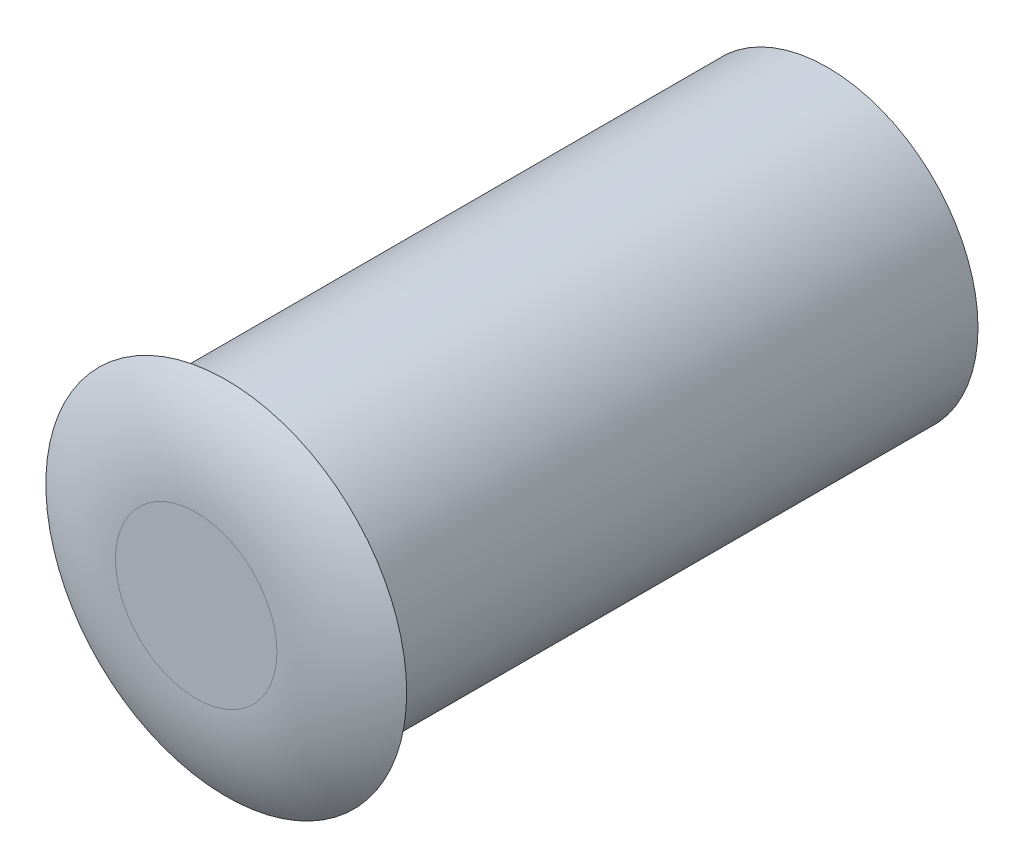
ISO-10303-21;
HEADER;
FILE_DESCRIPTION(('STEP AP214'),'2;1');
FILE_NAME('part.step','',(''),(''),'','','');
FILE_SCHEMA(('AUTOMOTIVE_DESIGN { 1 0 10303 214 1 1 1 1 }'));
ENDSEC;
DATA;
#1=APPLICATION_CONTEXT('core data for automotive mechanical design processes');
#2=APPLICATION_PROTOCOL_DEFINITION('international standard','automotive_design',2000,#1);
#3=PRODUCT_CONTEXT('',#1,'mechanical');
#4=PRODUCT('Part','Part','',(#3));
#5=PRODUCT_RELATED_PRODUCT_CATEGORY('part','',(#4));
#6=PRODUCT_DEFINITION_FORMATION('','',#4);
#7=PRODUCT_DEFINITION_CONTEXT('part definition',#1,'design');
#8=PRODUCT_DEFINITION('design','',#6,#7);
#9=PRODUCT_DEFINITION_SHAPE('','',#8);
#10=(LENGTH_UNIT() NAMED_UNIT(*) SI_UNIT(.MILLI.,.METRE.));
#11=(NAMED_UNIT(*) PLANE_ANGLE_UNIT() SI_UNIT($,.RADIAN.));
#12=(NAMED_UNIT(*) SI_UNIT($,.STERADIAN.) SOLID_ANGLE_UNIT());
#13=UNCERTAINTY_MEASURE_WITH_UNIT(LENGTH_MEASURE(1.E-05),#10,'distance_accuracy_value','');
#14=(GEOMETRIC_REPRESENTATION_CONTEXT(3) GLOBAL_UNCERTAINTY_ASSIGNED_CONTEXT((#13)) GLOBAL_UNIT_ASSIGNED_CONTEXT((#10,
#11,#12)) REPRESENTATION_CONTEXT('',''));
#15=CARTESIAN_POINT('',(0.,0.,0.));
#16=DIRECTION('',(0.,0.,1.));
#17=DIRECTION('',(1.,0.,0.));
#18=AXIS2_PLACEMENT_3D('',#15,#16,#17);
#19=CARTESIAN_POINT('',(0.,0.,1.));
#20=DIRECTION('',(0.,0.,1.));
#21=DIRECTION('',(1.,0.,0.));
#22=AXIS2_PLACEMENT_3D('',#19,#20,#21);
#23=PLANE('',#22);
#24=CARTESIAN_POINT('',(0.,0.,1.));
#25=DIRECTION('',(0.,0.,1.));
#26=DIRECTION('',(1.,0.,0.));
#27=AXIS2_PLACEMENT_3D('',#24,#25,#26);
#28=CIRCLE('',#27,2.6833752096446);
#29=CARTESIAN_POINT('',(2.6833752096446,0.,1.));
#30=VERTEX_POINT('',#29);
#31=EDGE_CURVE('E11',#30,#30,#28,.T.);
#32=ORIENTED_EDGE('',*,*,#31,.T.);
#33=EDGE_LOOP('',(#32));
#34=FACE_BOUND('',#33,.T.);
#35=ADVANCED_FACE('F43',(#34),#23,.T.);
#36=CARTESIAN_POINT('',(0.,0.,0.));
#37=DIRECTION('',(0.,0.,1.));
#38=DIRECTION('',(1.,0.,0.));
#39=AXIS2_PLACEMENT_3D('',#36,#37,#38);
#40=PLANE('',#39);
#41=CARTESIAN_POINT('',(0.,0.,0.));
#42=DIRECTION('',(0.,0.,1.));
#43=DIRECTION('',(1.,0.,0.));
#44=AXIS2_PLACEMENT_3D('',#41,#42,#43);
#45=CIRCLE('',#44,6.);
#46=CARTESIAN_POINT('',(6.,0.,0.));
#47=VERTEX_POINT('',#46);
#48=EDGE_CURVE('E50',#47,#47,#45,.T.);
#49=ORIENTED_EDGE('',*,*,#48,.F.);
#50=EDGE_LOOP('',(#49));
#51=FACE_BOUND('',#50,.T.);
#52=ADVANCED_FACE('F58',(#51),#40,.F.);
#53=CARTESIAN_POINT('',(0.,0.,-5.));
#54=DIRECTION('',(0.,0.,-1.));
#55=DIRECTION('',(-1.,0.,0.));
#56=AXIS2_PLACEMENT_3D('',#53,#54,#55);
#57=DEGENERATE_TOROIDAL_SURFACE('',#56,2.6833752096446,6.,.T.);
#58=ORIENTED_EDGE('',*,*,#48,.T.);
#59=EDGE_LOOP('',(#58));
#60=FACE_BOUND('',#59,.T.);
#61=ORIENTED_EDGE('',*,*,#31,.F.);
#62=EDGE_LOOP('',(#61));
#63=FACE_BOUND('',#62,.T.);
#64=ADVANCED_FACE('F45',(#60,#63),#57,.T.);
#65=CLOSED_SHELL('',(#35,#52,#64));
#66=MANIFOLD_SOLID_BREP('B2',#65);
#67=CARTESIAN_POINT('',(0.,0.,-20.));
#68=DIRECTION('',(0.,0.,1.));
#69=DIRECTION('',(1.,0.,0.));
#70=AXIS2_PLACEMENT_3D('',#67,#68,#69);
#71=CYLINDRICAL_SURFACE('',#70,5.);
#72=CARTESIAN_POINT('',(0.,0.,-20.));
#73=DIRECTION('',(0.,0.,1.));
#74=DIRECTION('',(1.,0.,0.));
#75=AXIS2_PLACEMENT_3D('',#72,#73,#74);
#76=CIRCLE('',#75,5.);
#77=CARTESIAN_POINT('',(5.,0.,-20.));
#78=VERTEX_POINT('',#77);
#79=EDGE_CURVE('E42',#78,#78,#76,.T.);
#80=ORIENTED_EDGE('',*,*,#79,.T.);
#81=EDGE_LOOP('',(#80));
#82=FACE_BOUND('',#81,.T.);
#83=CARTESIAN_POINT('',(0.,0.,0.));
#84=DIRECTION('',(0.,0.,1.));
#85=DIRECTION('',(1.,0.,0.));
#86=AXIS2_PLACEMENT_3D('',#83,#84,#85);
#87=CIRCLE('',#86,5.);
#88=CARTESIAN_POINT('',(5.,0.,0.));
#89=VERTEX_POINT('',#88);
#90=EDGE_CURVE('E87',#89,#89,#87,.T.);
#91=ORIENTED_EDGE('',*,*,#90,.F.);
#92=EDGE_LOOP('',(#91));
#93=FACE_BOUND('',#92,.T.);
#94=ADVANCED_FACE('F84',(#82,#93),#71,.T.);
#95=CARTESIAN_POINT('',(0.,0.,-20.));
#96=DIRECTION('',(0.,0.,1.));
#97=DIRECTION('',(1.,0.,0.));
#98=AXIS2_PLACEMENT_3D('',#95,#96,#97);
#99=PLANE('',#98);
#100=ORIENTED_EDGE('',*,*,#79,.F.);
#101=EDGE_LOOP('',(#100));
#102=FACE_BOUND('',#101,.T.);
#103=ADVANCED_FACE('F99',(#102),#99,.F.);
#104=CARTESIAN_POINT('',(0.,0.,0.));
#105=DIRECTION('',(0.,0.,1.));
#106=DIRECTION('',(1.,0.,0.));
#107=AXIS2_PLACEMENT_3D('',#104,#105,#106);
#108=PLANE('',#107);
#109=ORIENTED_EDGE('',*,*,#90,.T.);
#110=EDGE_LOOP('',(#109));
#111=FACE_BOUND('',#110,.T.);
#112=ADVANCED_FACE('F96',(#111),#108,.T.);
#113=CLOSED_SHELL('',(#94,#103,#112));
#114=MANIFOLD_SOLID_BREP('B6',#113);
#115=ADVANCED_BREP_SHAPE_REPRESENTATION('',(#18,#66,#114),#14);
#116=SHAPE_DEFINITION_REPRESENTATION(#9,#115);
ENDSEC;
END-ISO-10303-21;
